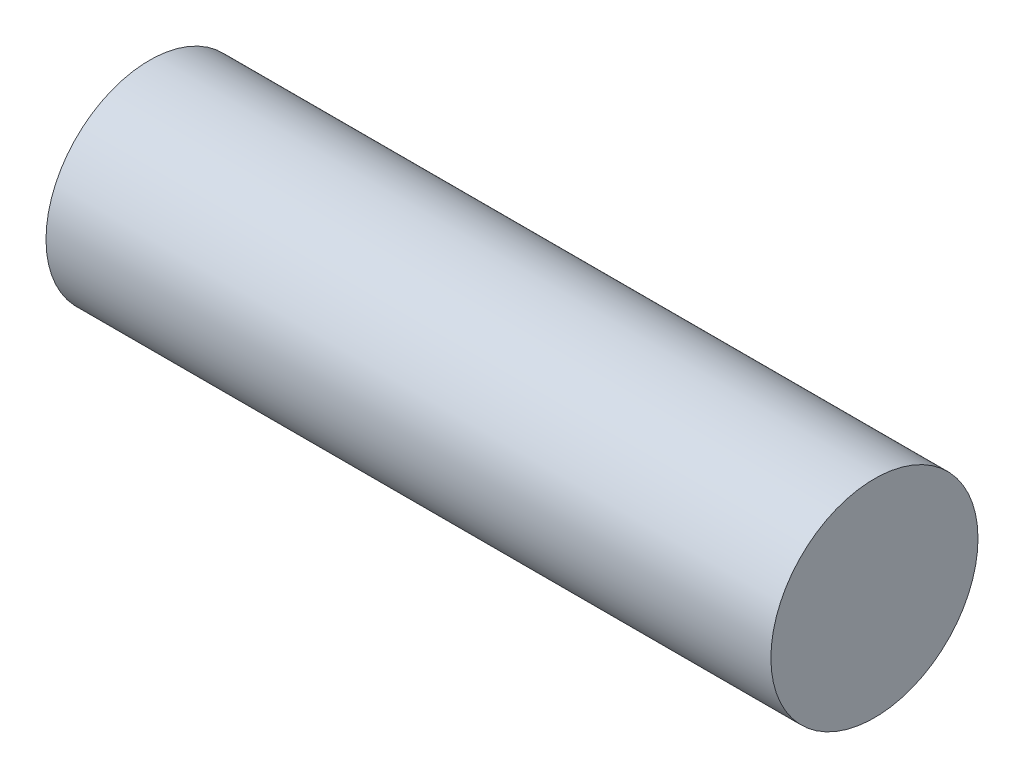
ISO-10303-21;
HEADER;
FILE_DESCRIPTION(('STEP AP214'),'2;1');
FILE_NAME('part.step','',(''),(''),'','','');
FILE_SCHEMA(('AUTOMOTIVE_DESIGN { 1 0 10303 214 1 1 1 1 }'));
ENDSEC;
DATA;
#1=APPLICATION_CONTEXT('core data for automotive mechanical design processes');
#2=APPLICATION_PROTOCOL_DEFINITION('international standard','automotive_design',2000,#1);
#3=PRODUCT_CONTEXT('',#1,'mechanical');
#4=PRODUCT('Part','Part','',(#3));
#5=PRODUCT_RELATED_PRODUCT_CATEGORY('part','',(#4));
#6=PRODUCT_DEFINITION_FORMATION('','',#4);
#7=PRODUCT_DEFINITION_CONTEXT('part definition',#1,'design');
#8=PRODUCT_DEFINITION('design','',#6,#7);
#9=PRODUCT_DEFINITION_SHAPE('','',#8);
#10=(LENGTH_UNIT() NAMED_UNIT(*) SI_UNIT(.MILLI.,.METRE.));
#11=(NAMED_UNIT(*) PLANE_ANGLE_UNIT() SI_UNIT($,.RADIAN.));
#12=(NAMED_UNIT(*) SI_UNIT($,.STERADIAN.) SOLID_ANGLE_UNIT());
#13=UNCERTAINTY_MEASURE_WITH_UNIT(LENGTH_MEASURE(1.E-05),#10,'distance_accuracy_value','');
#14=(GEOMETRIC_REPRESENTATION_CONTEXT(3) GLOBAL_UNCERTAINTY_ASSIGNED_CONTEXT((#13)) GLOBAL_UNIT_ASSIGNED_CONTEXT((#10,
#11,#12)) REPRESENTATION_CONTEXT('',''));
#15=CARTESIAN_POINT('',(0.,0.,0.));
#16=DIRECTION('',(0.,0.,1.));
#17=DIRECTION('',(1.,0.,0.));
#18=AXIS2_PLACEMENT_3D('',#15,#16,#17);
#19=CARTESIAN_POINT('',(17.5,0.,0.));
#20=DIRECTION('',(-1.,0.,0.));
#21=DIRECTION('',(0.,0.,1.));
#22=AXIS2_PLACEMENT_3D('',#19,#20,#21);
#23=CYLINDRICAL_SURFACE('',#22,5.);
#24=CARTESIAN_POINT('',(17.5,0.,0.));
#25=DIRECTION('',(1.,0.,0.));
#26=DIRECTION('',(0.,0.,-1.));
#27=AXIS2_PLACEMENT_3D('',#24,#25,#26);
#28=CIRCLE('',#27,5.);
#29=CARTESIAN_POINT('',(17.5,0.,-5.));
#30=VERTEX_POINT('',#29);
#31=EDGE_CURVE('E10',#30,#30,#28,.T.);
#32=ORIENTED_EDGE('',*,*,#31,.F.);
#33=EDGE_LOOP('',(#32));
#34=FACE_BOUND('',#33,.T.);
#35=CARTESIAN_POINT('',(-17.5,0.,0.));
#36=DIRECTION('',(1.,0.,0.));
#37=DIRECTION('',(0.,0.,-1.));
#38=AXIS2_PLACEMENT_3D('',#35,#36,#37);
#39=CIRCLE('',#38,5.);
#40=CARTESIAN_POINT('',(-17.5,0.,-5.));
#41=VERTEX_POINT('',#40);
#42=EDGE_CURVE('E46',#41,#41,#39,.T.);
#43=ORIENTED_EDGE('',*,*,#42,.T.);
#44=EDGE_LOOP('',(#43));
#45=FACE_BOUND('',#44,.T.);
#46=ADVANCED_FACE('F43',(#34,#45),#23,.T.);
#47=CARTESIAN_POINT('',(17.5,0.,0.));
#48=DIRECTION('',(1.,0.,0.));
#49=DIRECTION('',(0.,0.,-1.));
#50=AXIS2_PLACEMENT_3D('',#47,#48,#49);
#51=PLANE('',#50);
#52=ORIENTED_EDGE('',*,*,#31,.T.);
#53=EDGE_LOOP('',(#52));
#54=FACE_BOUND('',#53,.T.);
#55=ADVANCED_FACE('F58',(#54),#51,.T.);
#56=CARTESIAN_POINT('',(-17.5,0.,0.));
#57=DIRECTION('',(1.,0.,0.));
#58=DIRECTION('',(0.,0.,-1.));
#59=AXIS2_PLACEMENT_3D('',#56,#57,#58);
#60=PLANE('',#59);
#61=ORIENTED_EDGE('',*,*,#42,.F.);
#62=EDGE_LOOP('',(#61));
#63=FACE_BOUND('',#62,.T.);
#64=ADVANCED_FACE('F59',(#63),#60,.F.);
#65=CLOSED_SHELL('',(#46,#55,#64));
#66=MANIFOLD_SOLID_BREP('B2',#65);
#67=ADVANCED_BREP_SHAPE_REPRESENTATION('',(#18,#66),#14);
#68=SHAPE_DEFINITION_REPRESENTATION(#9,#67);
ENDSEC;
END-ISO-10303-21;
